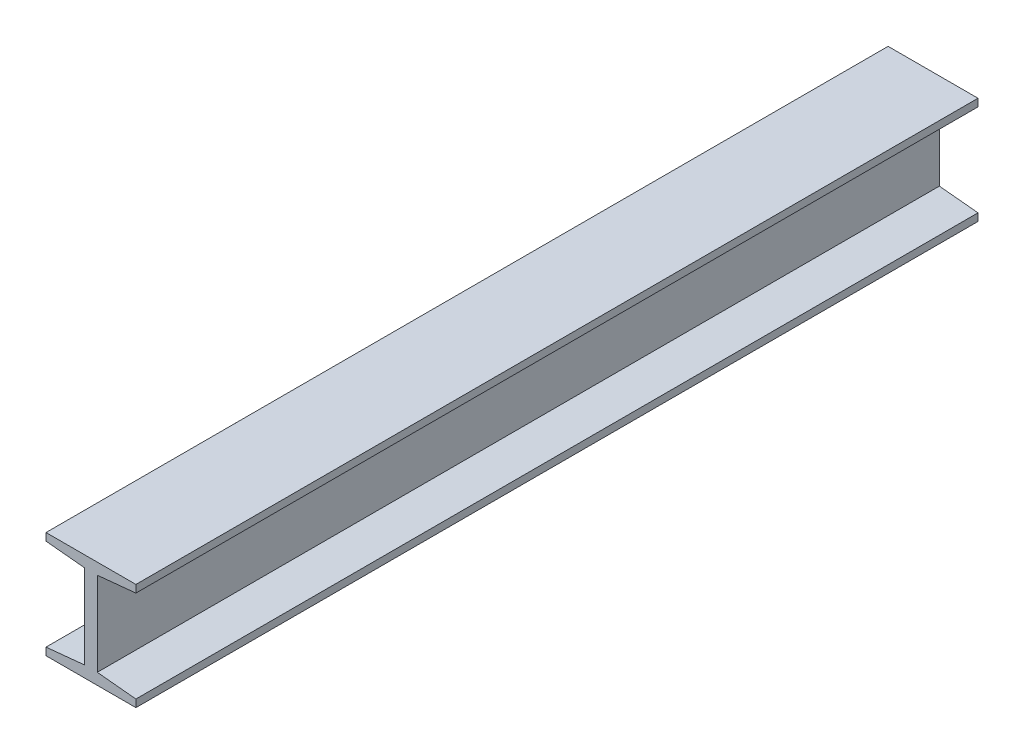
ISO-10303-21;
HEADER;
FILE_DESCRIPTION(('STEP AP214'),'2;1');
FILE_NAME('part.step','',(''),(''),'','','');
FILE_SCHEMA(('AUTOMOTIVE_DESIGN { 1 0 10303 214 1 1 1 1 }'));
ENDSEC;
DATA;
#1=APPLICATION_CONTEXT('core data for automotive mechanical design processes');
#2=APPLICATION_PROTOCOL_DEFINITION('international standard','automotive_design',2000,#1);
#3=PRODUCT_CONTEXT('',#1,'mechanical');
#4=PRODUCT('Part','Part','',(#3));
#5=PRODUCT_RELATED_PRODUCT_CATEGORY('part','',(#4));
#6=PRODUCT_DEFINITION_FORMATION('','',#4);
#7=PRODUCT_DEFINITION_CONTEXT('part definition',#1,'design');
#8=PRODUCT_DEFINITION('design','',#6,#7);
#9=PRODUCT_DEFINITION_SHAPE('','',#8);
#10=(LENGTH_UNIT() NAMED_UNIT(*) SI_UNIT(.MILLI.,.METRE.));
#11=(NAMED_UNIT(*) PLANE_ANGLE_UNIT() SI_UNIT($,.RADIAN.));
#12=(NAMED_UNIT(*) SI_UNIT($,.STERADIAN.) SOLID_ANGLE_UNIT());
#13=UNCERTAINTY_MEASURE_WITH_UNIT(LENGTH_MEASURE(1.E-05),#10,'distance_accuracy_value','');
#14=(GEOMETRIC_REPRESENTATION_CONTEXT(3) GLOBAL_UNCERTAINTY_ASSIGNED_CONTEXT((#13)) GLOBAL_UNIT_ASSIGNED_CONTEXT((#10,
#11,#12)) REPRESENTATION_CONTEXT('',''));
#15=CARTESIAN_POINT('',(0.,0.,0.));
#16=DIRECTION('',(0.,0.,1.));
#17=DIRECTION('',(1.,0.,0.));
#18=AXIS2_PLACEMENT_3D('',#15,#16,#17);
#19=CARTESIAN_POINT('',(32.03,38.025,600.));
#20=DIRECTION('',(-1.,0.,0.));
#21=DIRECTION('',(0.,0.,1.));
#22=AXIS2_PLACEMENT_3D('',#19,#20,#21);
#23=PLANE('',#22);
#24=DIRECTION('',(0.,1.,0.));
#25=VECTOR('',#24,1.);
#26=CARTESIAN_POINT('',(32.03,38.025,0.));
#27=LINE('',#26,#25);
#28=CARTESIAN_POINT('',(32.03,32.68,0.));
#29=VERTEX_POINT('',#28);
#30=CARTESIAN_POINT('',(32.03,38.025,0.));
#31=VERTEX_POINT('',#30);
#32=EDGE_CURVE('E157',#29,#31,#27,.T.);
#33=ORIENTED_EDGE('',*,*,#32,.T.);
#34=DIRECTION('',(0.,0.,-1.));
#35=VECTOR('',#34,1.);
#36=CARTESIAN_POINT('',(32.03,38.025,600.));
#37=LINE('',#36,#35);
#38=CARTESIAN_POINT('',(32.03,38.025,600.));
#39=VERTEX_POINT('',#38);
#40=EDGE_CURVE('E11',#39,#31,#37,.T.);
#41=ORIENTED_EDGE('',*,*,#40,.F.);
#42=DIRECTION('',(0.,1.,0.));
#43=VECTOR('',#42,1.);
#44=CARTESIAN_POINT('',(32.03,38.025,600.));
#45=LINE('',#44,#43);
#46=CARTESIAN_POINT('',(32.03,32.68,600.));
#47=VERTEX_POINT('',#46);
#48=EDGE_CURVE('E179',#47,#39,#45,.T.);
#49=ORIENTED_EDGE('',*,*,#48,.F.);
#50=DIRECTION('',(0.,0.,-1.));
#51=VECTOR('',#50,1.);
#52=CARTESIAN_POINT('',(32.03,32.68,600.));
#53=LINE('',#52,#51);
#54=EDGE_CURVE('E153',#47,#29,#53,.T.);
#55=ORIENTED_EDGE('',*,*,#54,.T.);
#56=EDGE_LOOP('',(#33,#41,#49,#55));
#57=FACE_BOUND('',#56,.T.);
#58=ADVANCED_FACE('F37',(#57),#23,.F.);
#59=CARTESIAN_POINT('',(-32.03,38.025,600.));
#60=DIRECTION('',(0.,-1.,0.));
#61=DIRECTION('',(0.,0.,-1.));
#62=AXIS2_PLACEMENT_3D('',#59,#60,#61);
#63=PLANE('',#62);
#64=DIRECTION('',(-1.,0.,0.));
#65=VECTOR('',#64,1.);
#66=CARTESIAN_POINT('',(-32.03,38.025,0.));
#67=LINE('',#66,#65);
#68=CARTESIAN_POINT('',(-32.03,38.025,0.));
#69=VERTEX_POINT('',#68);
#70=EDGE_CURVE('E160',#31,#69,#67,.T.);
#71=ORIENTED_EDGE('',*,*,#70,.T.);
#72=DIRECTION('',(0.,0.,-1.));
#73=VECTOR('',#72,1.);
#74=CARTESIAN_POINT('',(-32.03,38.025,600.));
#75=LINE('',#74,#73);
#76=CARTESIAN_POINT('',(-32.03,38.025,600.));
#77=VERTEX_POINT('',#76);
#78=EDGE_CURVE('E45',#77,#69,#75,.T.);
#79=ORIENTED_EDGE('',*,*,#78,.F.);
#80=DIRECTION('',(-1.,0.,0.));
#81=VECTOR('',#80,1.);
#82=CARTESIAN_POINT('',(-32.03,38.025,600.));
#83=LINE('',#82,#81);
#84=EDGE_CURVE('E108',#39,#77,#83,.T.);
#85=ORIENTED_EDGE('',*,*,#84,.F.);
#86=ORIENTED_EDGE('',*,*,#40,.T.);
#87=EDGE_LOOP('',(#71,#79,#85,#86));
#88=FACE_BOUND('',#87,.T.);
#89=ADVANCED_FACE('F257',(#88),#63,.F.);
#90=CARTESIAN_POINT('',(-32.03,38.025,600.));
#91=DIRECTION('',(1.,0.,0.));
#92=DIRECTION('',(0.,0.,-1.));
#93=AXIS2_PLACEMENT_3D('',#90,#91,#92);
#94=PLANE('',#93);
#95=DIRECTION('',(0.,-1.,0.));
#96=VECTOR('',#95,1.);
#97=CARTESIAN_POINT('',(-32.03,38.025,0.));
#98=LINE('',#97,#96);
#99=CARTESIAN_POINT('',(-32.03,32.68,0.));
#100=VERTEX_POINT('',#99);
#101=EDGE_CURVE('E162',#69,#100,#98,.T.);
#102=ORIENTED_EDGE('',*,*,#101,.T.);
#103=DIRECTION('',(0.,0.,-1.));
#104=VECTOR('',#103,1.);
#105=CARTESIAN_POINT('',(-32.03,32.68,600.));
#106=LINE('',#105,#104);
#107=CARTESIAN_POINT('',(-32.03,32.68,600.));
#108=VERTEX_POINT('',#107);
#109=EDGE_CURVE('E198',#108,#100,#106,.T.);
#110=ORIENTED_EDGE('',*,*,#109,.F.);
#111=DIRECTION('',(0.,-1.,0.));
#112=VECTOR('',#111,1.);
#113=CARTESIAN_POINT('',(-32.03,38.025,600.));
#114=LINE('',#113,#112);
#115=EDGE_CURVE('E206',#77,#108,#114,.T.);
#116=ORIENTED_EDGE('',*,*,#115,.F.);
#117=ORIENTED_EDGE('',*,*,#78,.T.);
#118=EDGE_LOOP('',(#102,#110,#116,#117));
#119=FACE_BOUND('',#118,.T.);
#120=ADVANCED_FACE('F204',(#119),#94,.F.);
#121=CARTESIAN_POINT('',(-32.03,32.68,600.));
#122=DIRECTION('',(0.0981788968931355,0.995168781767619,0.));
#123=DIRECTION('',(-0.995168781767619,0.0981788968931355,0.));
#124=AXIS2_PLACEMENT_3D('',#121,#122,#123);
#125=PLANE('',#124);
#126=DIRECTION('',(0.995168781767619,-0.0981788968931355,0.));
#127=VECTOR('',#126,1.);
#128=CARTESIAN_POINT('',(-32.03,32.68,0.));
#129=LINE('',#128,#127);
#130=CARTESIAN_POINT('',(-4.51,29.965,0.));
#131=VERTEX_POINT('',#130);
#132=EDGE_CURVE('E164',#100,#131,#129,.T.);
#133=ORIENTED_EDGE('',*,*,#132,.T.);
#134=DIRECTION('',(0.,0.,-1.));
#135=VECTOR('',#134,1.);
#136=CARTESIAN_POINT('',(-4.51,29.965,600.));
#137=LINE('',#136,#135);
#138=CARTESIAN_POINT('',(-4.51,29.965,600.));
#139=VERTEX_POINT('',#138);
#140=EDGE_CURVE('E195',#139,#131,#137,.T.);
#141=ORIENTED_EDGE('',*,*,#140,.F.);
#142=DIRECTION('',(0.995168781767619,-0.0981788968931355,0.));
#143=VECTOR('',#142,1.);
#144=CARTESIAN_POINT('',(-32.03,32.68,600.));
#145=LINE('',#144,#143);
#146=EDGE_CURVE('E224',#108,#139,#145,.T.);
#147=ORIENTED_EDGE('',*,*,#146,.F.);
#148=ORIENTED_EDGE('',*,*,#109,.T.);
#149=EDGE_LOOP('',(#133,#141,#147,#148));
#150=FACE_BOUND('',#149,.T.);
#151=ADVANCED_FACE('F215',(#150),#125,.F.);
#152=CARTESIAN_POINT('',(-4.51,29.965,600.));
#153=DIRECTION('',(1.,0.,0.));
#154=DIRECTION('',(0.,0.,-1.));
#155=AXIS2_PLACEMENT_3D('',#152,#153,#154);
#156=PLANE('',#155);
#157=DIRECTION('',(0.,-1.,0.));
#158=VECTOR('',#157,1.);
#159=CARTESIAN_POINT('',(-4.51,29.965,0.));
#160=LINE('',#159,#158);
#161=CARTESIAN_POINT('',(-4.51,-29.965,0.));
#162=VERTEX_POINT('',#161);
#163=EDGE_CURVE('E166',#131,#162,#160,.T.);
#164=ORIENTED_EDGE('',*,*,#163,.T.);
#165=DIRECTION('',(0.,0.,-1.));
#166=VECTOR('',#165,1.);
#167=CARTESIAN_POINT('',(-4.51,-29.965,600.));
#168=LINE('',#167,#166);
#169=CARTESIAN_POINT('',(-4.51,-29.965,600.));
#170=VERTEX_POINT('',#169);
#171=EDGE_CURVE('E192',#170,#162,#168,.T.);
#172=ORIENTED_EDGE('',*,*,#171,.F.);
#173=DIRECTION('',(0.,-1.,0.));
#174=VECTOR('',#173,1.);
#175=CARTESIAN_POINT('',(-4.51,29.965,600.));
#176=LINE('',#175,#174);
#177=EDGE_CURVE('E221',#139,#170,#176,.T.);
#178=ORIENTED_EDGE('',*,*,#177,.F.);
#179=ORIENTED_EDGE('',*,*,#140,.T.);
#180=EDGE_LOOP('',(#164,#172,#178,#179));
#181=FACE_BOUND('',#180,.T.);
#182=ADVANCED_FACE('F219',(#181),#156,.F.);
#183=CARTESIAN_POINT('',(-32.03,-32.68,600.));
#184=DIRECTION('',(0.0981788968931355,-0.995168781767619,0.));
#185=DIRECTION('',(0.995168781767619,0.0981788968931355,0.));
#186=AXIS2_PLACEMENT_3D('',#183,#184,#185);
#187=PLANE('',#186);
#188=DIRECTION('',(-0.995168781767619,-0.0981788968931355,0.));
#189=VECTOR('',#188,1.);
#190=CARTESIAN_POINT('',(-32.03,-32.68,0.));
#191=LINE('',#190,#189);
#192=CARTESIAN_POINT('',(-32.03,-32.68,0.));
#193=VERTEX_POINT('',#192);
#194=EDGE_CURVE('E168',#162,#193,#191,.T.);
#195=ORIENTED_EDGE('',*,*,#194,.T.);
#196=DIRECTION('',(0.,0.,-1.));
#197=VECTOR('',#196,1.);
#198=CARTESIAN_POINT('',(-32.03,-32.68,600.));
#199=LINE('',#198,#197);
#200=CARTESIAN_POINT('',(-32.03,-32.68,600.));
#201=VERTEX_POINT('',#200);
#202=EDGE_CURVE('E189',#201,#193,#199,.T.);
#203=ORIENTED_EDGE('',*,*,#202,.F.);
#204=DIRECTION('',(-0.995168781767619,-0.0981788968931355,0.));
#205=VECTOR('',#204,1.);
#206=CARTESIAN_POINT('',(-32.03,-32.68,600.));
#207=LINE('',#206,#205);
#208=EDGE_CURVE('E223',#170,#201,#207,.T.);
#209=ORIENTED_EDGE('',*,*,#208,.F.);
#210=ORIENTED_EDGE('',*,*,#171,.T.);
#211=EDGE_LOOP('',(#195,#203,#209,#210));
#212=FACE_BOUND('',#211,.T.);
#213=ADVANCED_FACE('F270',(#212),#187,.F.);
#214=CARTESIAN_POINT('',(-32.03,-38.025,600.));
#215=DIRECTION('',(1.,0.,0.));
#216=DIRECTION('',(0.,0.,-1.));
#217=AXIS2_PLACEMENT_3D('',#214,#215,#216);
#218=PLANE('',#217);
#219=DIRECTION('',(0.,-1.,0.));
#220=VECTOR('',#219,1.);
#221=CARTESIAN_POINT('',(-32.03,-38.025,0.));
#222=LINE('',#221,#220);
#223=CARTESIAN_POINT('',(-32.03,-38.025,0.));
#224=VERTEX_POINT('',#223);
#225=EDGE_CURVE('E170',#193,#224,#222,.T.);
#226=ORIENTED_EDGE('',*,*,#225,.T.);
#227=DIRECTION('',(0.,0.,-1.));
#228=VECTOR('',#227,1.);
#229=CARTESIAN_POINT('',(-32.03,-38.025,600.));
#230=LINE('',#229,#228);
#231=CARTESIAN_POINT('',(-32.03,-38.025,600.));
#232=VERTEX_POINT('',#231);
#233=EDGE_CURVE('E186',#232,#224,#230,.T.);
#234=ORIENTED_EDGE('',*,*,#233,.F.);
#235=DIRECTION('',(0.,-1.,0.));
#236=VECTOR('',#235,1.);
#237=CARTESIAN_POINT('',(-32.03,-38.025,600.));
#238=LINE('',#237,#236);
#239=EDGE_CURVE('E226',#201,#232,#238,.T.);
#240=ORIENTED_EDGE('',*,*,#239,.F.);
#241=ORIENTED_EDGE('',*,*,#202,.T.);
#242=EDGE_LOOP('',(#226,#234,#240,#241));
#243=FACE_BOUND('',#242,.T.);
#244=ADVANCED_FACE('F273',(#243),#218,.F.);
#245=CARTESIAN_POINT('',(-32.03,-38.025,600.));
#246=DIRECTION('',(0.,1.,0.));
#247=DIRECTION('',(0.,0.,1.));
#248=AXIS2_PLACEMENT_3D('',#245,#246,#247);
#249=PLANE('',#248);
#250=DIRECTION('',(1.,0.,0.));
#251=VECTOR('',#250,1.);
#252=CARTESIAN_POINT('',(-32.03,-38.025,0.));
#253=LINE('',#252,#251);
#254=CARTESIAN_POINT('',(32.03,-38.025,0.));
#255=VERTEX_POINT('',#254);
#256=EDGE_CURVE('E172',#224,#255,#253,.T.);
#257=ORIENTED_EDGE('',*,*,#256,.T.);
#258=DIRECTION('',(0.,0.,-1.));
#259=VECTOR('',#258,1.);
#260=CARTESIAN_POINT('',(32.03,-38.025,600.));
#261=LINE('',#260,#259);
#262=CARTESIAN_POINT('',(32.03,-38.025,600.));
#263=VERTEX_POINT('',#262);
#264=EDGE_CURVE('E183',#263,#255,#261,.T.);
#265=ORIENTED_EDGE('',*,*,#264,.F.);
#266=DIRECTION('',(1.,0.,0.));
#267=VECTOR('',#266,1.);
#268=CARTESIAN_POINT('',(-32.03,-38.025,600.));
#269=LINE('',#268,#267);
#270=EDGE_CURVE('E232',#232,#263,#269,.T.);
#271=ORIENTED_EDGE('',*,*,#270,.F.);
#272=ORIENTED_EDGE('',*,*,#233,.T.);
#273=EDGE_LOOP('',(#257,#265,#271,#272));
#274=FACE_BOUND('',#273,.T.);
#275=ADVANCED_FACE('F238',(#274),#249,.F.);
#276=CARTESIAN_POINT('',(32.03,-38.025,600.));
#277=DIRECTION('',(-1.,0.,0.));
#278=DIRECTION('',(0.,0.,1.));
#279=AXIS2_PLACEMENT_3D('',#276,#277,#278);
#280=PLANE('',#279);
#281=DIRECTION('',(0.,1.,0.));
#282=VECTOR('',#281,1.);
#283=CARTESIAN_POINT('',(32.03,-38.025,0.));
#284=LINE('',#283,#282);
#285=CARTESIAN_POINT('',(32.03,-32.68,0.));
#286=VERTEX_POINT('',#285);
#287=EDGE_CURVE('E174',#255,#286,#284,.T.);
#288=ORIENTED_EDGE('',*,*,#287,.T.);
#289=DIRECTION('',(0.,0.,-1.));
#290=VECTOR('',#289,1.);
#291=CARTESIAN_POINT('',(32.03,-32.68,600.));
#292=LINE('',#291,#290);
#293=CARTESIAN_POINT('',(32.03,-32.68,600.));
#294=VERTEX_POINT('',#293);
#295=EDGE_CURVE('E148',#294,#286,#292,.T.);
#296=ORIENTED_EDGE('',*,*,#295,.F.);
#297=DIRECTION('',(0.,1.,0.));
#298=VECTOR('',#297,1.);
#299=CARTESIAN_POINT('',(32.03,-38.025,600.));
#300=LINE('',#299,#298);
#301=EDGE_CURVE('E139',#263,#294,#300,.T.);
#302=ORIENTED_EDGE('',*,*,#301,.F.);
#303=ORIENTED_EDGE('',*,*,#264,.T.);
#304=EDGE_LOOP('',(#288,#296,#302,#303));
#305=FACE_BOUND('',#304,.T.);
#306=ADVANCED_FACE('F242',(#305),#280,.F.);
#307=CARTESIAN_POINT('',(32.03,-32.68,600.));
#308=DIRECTION('',(-0.0981788968931355,-0.995168781767619,0.));
#309=DIRECTION('',(0.995168781767619,-0.0981788968931355,0.));
#310=AXIS2_PLACEMENT_3D('',#307,#308,#309);
#311=PLANE('',#310);
#312=DIRECTION('',(-0.995168781767619,0.0981788968931355,0.));
#313=VECTOR('',#312,1.);
#314=CARTESIAN_POINT('',(32.03,-32.68,0.));
#315=LINE('',#314,#313);
#316=CARTESIAN_POINT('',(4.51,-29.965,0.));
#317=VERTEX_POINT('',#316);
#318=EDGE_CURVE('E147',#286,#317,#315,.T.);
#319=ORIENTED_EDGE('',*,*,#318,.T.);
#320=DIRECTION('',(0.,0.,-1.));
#321=VECTOR('',#320,1.);
#322=CARTESIAN_POINT('',(4.51,-29.965,600.));
#323=LINE('',#322,#321);
#324=CARTESIAN_POINT('',(4.51,-29.965,600.));
#325=VERTEX_POINT('',#324);
#326=EDGE_CURVE('E144',#325,#317,#323,.T.);
#327=ORIENTED_EDGE('',*,*,#326,.F.);
#328=DIRECTION('',(-0.995168781767619,0.0981788968931355,0.));
#329=VECTOR('',#328,1.);
#330=CARTESIAN_POINT('',(32.03,-32.68,600.));
#331=LINE('',#330,#329);
#332=EDGE_CURVE('E133',#294,#325,#331,.T.);
#333=ORIENTED_EDGE('',*,*,#332,.F.);
#334=ORIENTED_EDGE('',*,*,#295,.T.);
#335=EDGE_LOOP('',(#319,#327,#333,#334));
#336=FACE_BOUND('',#335,.T.);
#337=ADVANCED_FACE('F145',(#336),#311,.F.);
#338=CARTESIAN_POINT('',(4.51,29.965,600.));
#339=DIRECTION('',(-1.,0.,0.));
#340=DIRECTION('',(0.,0.,1.));
#341=AXIS2_PLACEMENT_3D('',#338,#339,#340);
#342=PLANE('',#341);
#343=DIRECTION('',(0.,1.,0.));
#344=VECTOR('',#343,1.);
#345=CARTESIAN_POINT('',(4.51,29.965,0.));
#346=LINE('',#345,#344);
#347=CARTESIAN_POINT('',(4.51,29.965,0.));
#348=VERTEX_POINT('',#347);
#349=EDGE_CURVE('E94',#317,#348,#346,.T.);
#350=ORIENTED_EDGE('',*,*,#349,.T.);
#351=DIRECTION('',(0.,0.,-1.));
#352=VECTOR('',#351,1.);
#353=CARTESIAN_POINT('',(4.51,29.965,600.));
#354=LINE('',#353,#352);
#355=CARTESIAN_POINT('',(4.51,29.965,600.));
#356=VERTEX_POINT('',#355);
#357=EDGE_CURVE('E149',#356,#348,#354,.T.);
#358=ORIENTED_EDGE('',*,*,#357,.F.);
#359=DIRECTION('',(0.,1.,0.));
#360=VECTOR('',#359,1.);
#361=CARTESIAN_POINT('',(4.51,29.965,600.));
#362=LINE('',#361,#360);
#363=EDGE_CURVE('E137',#325,#356,#362,.T.);
#364=ORIENTED_EDGE('',*,*,#363,.F.);
#365=ORIENTED_EDGE('',*,*,#326,.T.);
#366=EDGE_LOOP('',(#350,#358,#364,#365));
#367=FACE_BOUND('',#366,.T.);
#368=ADVANCED_FACE('F151',(#367),#342,.F.);
#369=CARTESIAN_POINT('',(32.03,32.68,600.));
#370=DIRECTION('',(-0.0981788968931355,0.995168781767619,0.));
#371=DIRECTION('',(-0.995168781767619,-0.0981788968931355,0.));
#372=AXIS2_PLACEMENT_3D('',#369,#370,#371);
#373=PLANE('',#372);
#374=DIRECTION('',(0.995168781767619,0.0981788968931355,0.));
#375=VECTOR('',#374,1.);
#376=CARTESIAN_POINT('',(32.03,32.68,0.));
#377=LINE('',#376,#375);
#378=EDGE_CURVE('E100',#348,#29,#377,.T.);
#379=ORIENTED_EDGE('',*,*,#378,.T.);
#380=ORIENTED_EDGE('',*,*,#54,.F.);
#381=DIRECTION('',(0.995168781767619,0.0981788968931355,0.));
#382=VECTOR('',#381,1.);
#383=CARTESIAN_POINT('',(32.03,32.68,600.));
#384=LINE('',#383,#382);
#385=EDGE_CURVE('E53',#356,#47,#384,.T.);
#386=ORIENTED_EDGE('',*,*,#385,.F.);
#387=ORIENTED_EDGE('',*,*,#357,.T.);
#388=EDGE_LOOP('',(#379,#380,#386,#387));
#389=FACE_BOUND('',#388,.T.);
#390=ADVANCED_FACE('F246',(#389),#373,.F.);
#391=CARTESIAN_POINT('',(0.,0.,600.));
#392=DIRECTION('',(0.,0.,1.));
#393=DIRECTION('',(1.,0.,0.));
#394=AXIS2_PLACEMENT_3D('',#391,#392,#393);
#395=PLANE('',#394);
#396=ORIENTED_EDGE('',*,*,#48,.T.);
#397=ORIENTED_EDGE('',*,*,#84,.T.);
#398=ORIENTED_EDGE('',*,*,#115,.T.);
#399=ORIENTED_EDGE('',*,*,#146,.T.);
#400=ORIENTED_EDGE('',*,*,#177,.T.);
#401=ORIENTED_EDGE('',*,*,#208,.T.);
#402=ORIENTED_EDGE('',*,*,#239,.T.);
#403=ORIENTED_EDGE('',*,*,#270,.T.);
#404=ORIENTED_EDGE('',*,*,#301,.T.);
#405=ORIENTED_EDGE('',*,*,#332,.T.);
#406=ORIENTED_EDGE('',*,*,#363,.T.);
#407=ORIENTED_EDGE('',*,*,#385,.T.);
#408=EDGE_LOOP('',(#396,#397,#398,#399,#400,#401,#402,#403,#404,#405,#406,#407));
#409=FACE_BOUND('',#408,.T.);
#410=ADVANCED_FACE('F135',(#409),#395,.T.);
#411=CARTESIAN_POINT('',(0.,0.,0.));
#412=DIRECTION('',(0.,0.,1.));
#413=DIRECTION('',(1.,0.,0.));
#414=AXIS2_PLACEMENT_3D('',#411,#412,#413);
#415=PLANE('',#414);
#416=ORIENTED_EDGE('',*,*,#32,.F.);
#417=ORIENTED_EDGE('',*,*,#378,.F.);
#418=ORIENTED_EDGE('',*,*,#349,.F.);
#419=ORIENTED_EDGE('',*,*,#318,.F.);
#420=ORIENTED_EDGE('',*,*,#287,.F.);
#421=ORIENTED_EDGE('',*,*,#256,.F.);
#422=ORIENTED_EDGE('',*,*,#225,.F.);
#423=ORIENTED_EDGE('',*,*,#194,.F.);
#424=ORIENTED_EDGE('',*,*,#163,.F.);
#425=ORIENTED_EDGE('',*,*,#132,.F.);
#426=ORIENTED_EDGE('',*,*,#101,.F.);
#427=ORIENTED_EDGE('',*,*,#70,.F.);
#428=EDGE_LOOP('',(#416,#417,#418,#419,#420,#421,#422,#423,#424,#425,#426,#427));
#429=FACE_BOUND('',#428,.T.);
#430=ADVANCED_FACE('F210',(#429),#415,.F.);
#431=CLOSED_SHELL('',(#58,#89,#120,#151,#182,#213,#244,#275,#306,#337,#368,#390,#410,#430));
#432=MANIFOLD_SOLID_BREP('B2',#431);
#433=ADVANCED_BREP_SHAPE_REPRESENTATION('',(#18,#432),#14);
#434=SHAPE_DEFINITION_REPRESENTATION(#9,#433);
ENDSEC;
END-ISO-10303-21;
